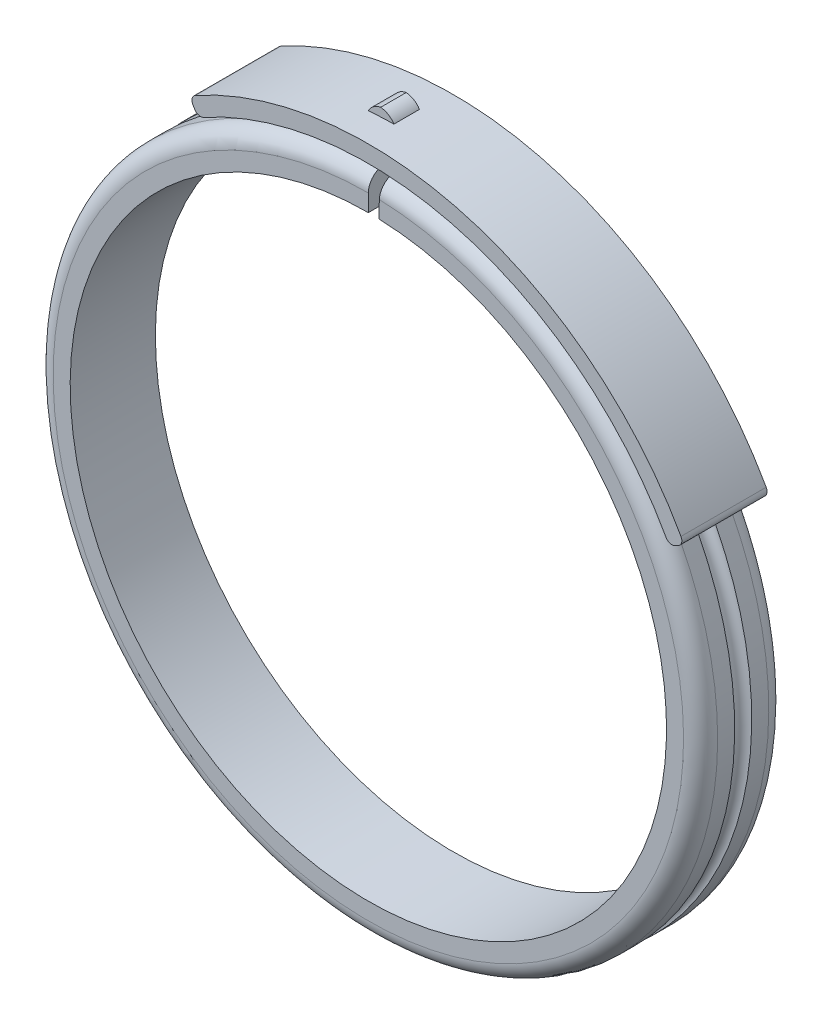
ISO-10303-21;
HEADER;
FILE_DESCRIPTION(('STEP AP214'),'2;1');
FILE_NAME('part.step','',(''),(''),'','','');
FILE_SCHEMA(('AUTOMOTIVE_DESIGN { 1 0 10303 214 1 1 1 1 }'));
ENDSEC;
DATA;
#1=APPLICATION_CONTEXT('core data for automotive mechanical design processes');
#2=APPLICATION_PROTOCOL_DEFINITION('international standard','automotive_design',2000,#1);
#3=PRODUCT_CONTEXT('',#1,'mechanical');
#4=PRODUCT('Part','Part','',(#3));
#5=PRODUCT_RELATED_PRODUCT_CATEGORY('part','',(#4));
#6=PRODUCT_DEFINITION_FORMATION('','',#4);
#7=PRODUCT_DEFINITION_CONTEXT('part definition',#1,'design');
#8=PRODUCT_DEFINITION('design','',#6,#7);
#9=PRODUCT_DEFINITION_SHAPE('','',#8);
#10=(LENGTH_UNIT() NAMED_UNIT(*) SI_UNIT(.MILLI.,.METRE.));
#11=(NAMED_UNIT(*) PLANE_ANGLE_UNIT() SI_UNIT($,.RADIAN.));
#12=(NAMED_UNIT(*) SI_UNIT($,.STERADIAN.) SOLID_ANGLE_UNIT());
#13=UNCERTAINTY_MEASURE_WITH_UNIT(LENGTH_MEASURE(1.E-05),#10,'distance_accuracy_value','');
#14=(GEOMETRIC_REPRESENTATION_CONTEXT(3) GLOBAL_UNCERTAINTY_ASSIGNED_CONTEXT((#13)) GLOBAL_UNIT_ASSIGNED_CONTEXT((#10,
#11,#12)) REPRESENTATION_CONTEXT('',''));
#15=CARTESIAN_POINT('',(0.,0.,0.));
#16=DIRECTION('',(0.,0.,1.));
#17=DIRECTION('',(1.,0.,0.));
#18=AXIS2_PLACEMENT_3D('',#15,#16,#17);
#19=CARTESIAN_POINT('',(0.,0.,10.));
#20=DIRECTION('',(0.,0.,-1.));
#21=DIRECTION('',(-1.,0.,0.));
#22=AXIS2_PLACEMENT_3D('',#19,#20,#21);
#23=CYLINDRICAL_SURFACE('',#22,39.);
#24=DIRECTION('',(0.,0.,-1.));
#25=VECTOR('',#24,1.);
#26=CARTESIAN_POINT('',(0.,39.,10.));
#27=LINE('',#26,#25);
#28=CARTESIAN_POINT('',(0.,39.,4.00000513685877));
#29=VERTEX_POINT('',#28);
#30=CARTESIAN_POINT('',(0.,39.,2.));
#31=VERTEX_POINT('',#30);
#32=EDGE_CURVE('E345',#29,#31,#27,.T.);
#33=ORIENTED_EDGE('',*,*,#32,.T.);
#34=CARTESIAN_POINT('',(0.,0.,2.));
#35=DIRECTION('',(0.,0.,1.));
#36=DIRECTION('',(1.,0.,0.));
#37=AXIS2_PLACEMENT_3D('',#34,#35,#36);
#38=CIRCLE('',#37,39.);
#39=CARTESIAN_POINT('',(1.36108037139754,38.9762422537448,2.));
#40=VERTEX_POINT('',#39);
#41=EDGE_CURVE('E258',#31,#40,#38,.T.);
#42=ORIENTED_EDGE('',*,*,#41,.T.);
#43=DIRECTION('',(0.,0.,-1.));
#44=VECTOR('',#43,1.);
#45=CARTESIAN_POINT('',(1.36108037139754,38.9762422537448,10.));
#46=LINE('',#45,#44);
#47=CARTESIAN_POINT('',(1.36108037139754,38.9762422537447,4.00000513685877));
#48=VERTEX_POINT('',#47);
#49=EDGE_CURVE('E269',#48,#40,#46,.T.);
#50=ORIENTED_EDGE('',*,*,#49,.F.);
#51=CARTESIAN_POINT('',(0.,0.,4.00000513685877));
#52=DIRECTION('',(0.,0.,1.));
#53=DIRECTION('',(1.,0.,0.));
#54=AXIS2_PLACEMENT_3D('',#51,#52,#53);
#55=CIRCLE('',#54,39.);
#56=CARTESIAN_POINT('',(-3.5,38.8426312188036,4.00000513685877));
#57=VERTEX_POINT('',#56);
#58=EDGE_CURVE('E249',#48,#57,#55,.F.);
#59=ORIENTED_EDGE('',*,*,#58,.T.);
#60=DIRECTION('',(0.,0.,-1.));
#61=VECTOR('',#60,1.);
#62=CARTESIAN_POINT('',(-3.5,38.8426312188039,10.));
#63=LINE('',#62,#61);
#64=CARTESIAN_POINT('',(-3.5,38.8426312188039,3.5));
#65=VERTEX_POINT('',#64);
#66=EDGE_CURVE('E265',#57,#65,#63,.T.);
#67=ORIENTED_EDGE('',*,*,#66,.T.);
#68=CARTESIAN_POINT('',(0.,0.,3.5));
#69=DIRECTION('',(0.,0.,1.));
#70=DIRECTION('',(1.,0.,0.));
#71=AXIS2_PLACEMENT_3D('',#68,#69,#70);
#72=CIRCLE('',#71,39.);
#73=CARTESIAN_POINT('',(-0.499999999999998,38.9967947400809,3.5));
#74=VERTEX_POINT('',#73);
#75=EDGE_CURVE('E285',#74,#65,#72,.T.);
#76=ORIENTED_EDGE('',*,*,#75,.F.);
#77=DIRECTION('',(0.,0.,-1.));
#78=VECTOR('',#77,1.);
#79=CARTESIAN_POINT('',(-0.5,38.9967947400809,10.));
#80=LINE('',#79,#78);
#81=CARTESIAN_POINT('',(-0.5,38.9967947400809,4.00000513685877));
#82=VERTEX_POINT('',#81);
#83=EDGE_CURVE('E298',#82,#74,#80,.T.);
#84=ORIENTED_EDGE('',*,*,#83,.F.);
#85=EDGE_CURVE('E273',#82,#29,#55,.F.);
#86=ORIENTED_EDGE('',*,*,#85,.T.);
#87=EDGE_LOOP('',(#33,#42,#50,#59,#67,#76,#84,#86));
#88=FACE_BOUND('',#87,.T.);
#89=ADVANCED_FACE('F77',(#88),#23,.T.);
#90=CARTESIAN_POINT('',(-0.5,38.9967947400809,6.5));
#91=DIRECTION('',(0.,0.,1.));
#92=DIRECTION('',(1.,0.,0.));
#93=AXIS2_PLACEMENT_3D('',#90,#91,#92);
#94=PLANE('',#93);
#95=CARTESIAN_POINT('',(0.,0.,6.5));
#96=DIRECTION('',(0.,0.,1.));
#97=DIRECTION('',(1.,0.,0.));
#98=AXIS2_PLACEMENT_3D('',#95,#96,#97);
#99=CIRCLE('',#98,40.);
#100=CARTESIAN_POINT('',(-3.5,39.8465807817936,6.5));
#101=VERTEX_POINT('',#100);
#102=CARTESIAN_POINT('',(-0.5,39.9968748779201,6.5));
#103=VERTEX_POINT('',#102);
#104=EDGE_CURVE('E546',#101,#103,#99,.F.);
#105=ORIENTED_EDGE('',*,*,#104,.F.);
#106=DIRECTION('',(0.,1.,0.));
#107=VECTOR('',#106,1.);
#108=CARTESIAN_POINT('',(-3.5,38.8426312188039,6.5));
#109=LINE('',#108,#107);
#110=CARTESIAN_POINT('',(-3.5,38.8426312188039,6.5));
#111=VERTEX_POINT('',#110);
#112=EDGE_CURVE('E304',#111,#101,#109,.T.);
#113=ORIENTED_EDGE('',*,*,#112,.F.);
#114=CARTESIAN_POINT('',(0.,0.,6.5));
#115=DIRECTION('',(0.,0.,-1.));
#116=DIRECTION('',(-1.,0.,0.));
#117=AXIS2_PLACEMENT_3D('',#114,#115,#116);
#118=CIRCLE('',#117,39.);
#119=CARTESIAN_POINT('',(-0.5,38.9967947400809,6.5));
#120=VERTEX_POINT('',#119);
#121=EDGE_CURVE('E299',#111,#120,#118,.T.);
#122=ORIENTED_EDGE('',*,*,#121,.T.);
#123=DIRECTION('',(0.,1.,0.));
#124=VECTOR('',#123,1.);
#125=CARTESIAN_POINT('',(-0.5,38.9967947400809,6.5));
#126=LINE('',#125,#124);
#127=EDGE_CURVE('E303',#120,#103,#126,.T.);
#128=ORIENTED_EDGE('',*,*,#127,.T.);
#129=EDGE_LOOP('',(#105,#113,#122,#128));
#130=FACE_BOUND('',#129,.T.);
#131=ADVANCED_FACE('F420',(#130),#94,.T.);
#132=CARTESIAN_POINT('',(-3.5,38.8426312188039,3.5));
#133=DIRECTION('',(0.,0.,-1.));
#134=DIRECTION('',(-1.,0.,0.));
#135=AXIS2_PLACEMENT_3D('',#132,#133,#134);
#136=PLANE('',#135);
#137=CARTESIAN_POINT('',(0.,0.,3.5));
#138=DIRECTION('',(0.,0.,-1.));
#139=DIRECTION('',(-1.,0.,0.));
#140=AXIS2_PLACEMENT_3D('',#137,#138,#139);
#141=CIRCLE('',#140,40.);
#142=CARTESIAN_POINT('',(-0.499999999999998,39.9968748779201,3.5));
#143=VERTEX_POINT('',#142);
#144=CARTESIAN_POINT('',(-3.5,39.8465807817936,3.5));
#145=VERTEX_POINT('',#144);
#146=EDGE_CURVE('E504',#143,#145,#141,.F.);
#147=ORIENTED_EDGE('',*,*,#146,.F.);
#148=DIRECTION('',(0.,1.,0.));
#149=VECTOR('',#148,1.);
#150=CARTESIAN_POINT('',(-0.499999999999998,38.9967947400809,3.5));
#151=LINE('',#150,#149);
#152=EDGE_CURVE('E293',#74,#143,#151,.T.);
#153=ORIENTED_EDGE('',*,*,#152,.F.);
#154=ORIENTED_EDGE('',*,*,#75,.T.);
#155=DIRECTION('',(0.,1.,0.));
#156=VECTOR('',#155,1.);
#157=CARTESIAN_POINT('',(-3.5,38.8426312188039,3.5));
#158=LINE('',#157,#156);
#159=EDGE_CURVE('E277',#65,#145,#158,.T.);
#160=ORIENTED_EDGE('',*,*,#159,.T.);
#161=EDGE_LOOP('',(#147,#153,#154,#160));
#162=FACE_BOUND('',#161,.T.);
#163=ADVANCED_FACE('F413',(#162),#136,.T.);
#164=CARTESIAN_POINT('',(0.,0.,10.));
#165=DIRECTION('',(-1.,0.,0.));
#166=DIRECTION('',(0.,0.,1.));
#167=AXIS2_PLACEMENT_3D('',#164,#165,#166);
#168=PLANE('',#167);
#169=DIRECTION('',(0.,1.,0.));
#170=VECTOR('',#169,1.);
#171=CARTESIAN_POINT('',(0.,0.,0.));
#172=LINE('',#171,#170);
#173=CARTESIAN_POINT('',(0.,35.,0.));
#174=VERTEX_POINT('',#173);
#175=CARTESIAN_POINT('',(0.,37.,0.));
#176=VERTEX_POINT('',#175);
#177=EDGE_CURVE('E284',#174,#176,#172,.T.);
#178=ORIENTED_EDGE('',*,*,#177,.T.);
#179=CARTESIAN_POINT('',(0.,37.,2.));
#180=DIRECTION('',(-1.,0.,0.));
#181=DIRECTION('',(0.,0.,1.));
#182=AXIS2_PLACEMENT_3D('',#179,#180,#181);
#183=CIRCLE('',#182,2.);
#184=EDGE_CURVE('E449',#176,#31,#183,.F.);
#185=ORIENTED_EDGE('',*,*,#184,.T.);
#186=ORIENTED_EDGE('',*,*,#32,.F.);
#187=CARTESIAN_POINT('',(0.,38.9967947400809,5.));
#188=DIRECTION('',(-1.,0.,0.));
#189=DIRECTION('',(0.,0.,1.));
#190=AXIS2_PLACEMENT_3D('',#187,#188,#189);
#191=CIRCLE('',#190,1.);
#192=CARTESIAN_POINT('',(0.,39.,5.99999486314123));
#193=VERTEX_POINT('',#192);
#194=EDGE_CURVE('E371',#29,#193,#191,.T.);
#195=ORIENTED_EDGE('',*,*,#194,.T.);
#196=CARTESIAN_POINT('',(0.,39.,8.));
#197=VERTEX_POINT('',#196);
#198=EDGE_CURVE('E346',#197,#193,#27,.T.);
#199=ORIENTED_EDGE('',*,*,#198,.F.);
#200=CARTESIAN_POINT('',(0.,37.,8.));
#201=DIRECTION('',(-1.,0.,0.));
#202=DIRECTION('',(0.,0.,1.));
#203=AXIS2_PLACEMENT_3D('',#200,#201,#202);
#204=CIRCLE('',#203,2.);
#205=CARTESIAN_POINT('',(0.,37.,10.));
#206=VERTEX_POINT('',#205);
#207=EDGE_CURVE('E93',#197,#206,#204,.F.);
#208=ORIENTED_EDGE('',*,*,#207,.T.);
#209=DIRECTION('',(0.,1.,0.));
#210=VECTOR('',#209,1.);
#211=CARTESIAN_POINT('',(0.,0.,10.));
#212=LINE('',#211,#210);
#213=CARTESIAN_POINT('',(0.,35.,10.));
#214=VERTEX_POINT('',#213);
#215=EDGE_CURVE('E314',#214,#206,#212,.T.);
#216=ORIENTED_EDGE('',*,*,#215,.F.);
#217=DIRECTION('',(0.,0.,-1.));
#218=VECTOR('',#217,1.);
#219=CARTESIAN_POINT('',(0.,35.,10.));
#220=LINE('',#219,#218);
#221=EDGE_CURVE('E326',#214,#174,#220,.T.);
#222=ORIENTED_EDGE('',*,*,#221,.T.);
#223=EDGE_LOOP('',(#178,#185,#186,#195,#199,#208,#216,#222));
#224=FACE_BOUND('',#223,.T.);
#225=ADVANCED_FACE('F425',(#224),#168,.F.);
#226=CARTESIAN_POINT('',(1.36108037139754,38.9762422537448,8.));
#227=VERTEX_POINT('',#226);
#228=CARTESIAN_POINT('',(1.36108037139754,38.9762422537447,5.99999486314123));
#229=VERTEX_POINT('',#228);
#230=EDGE_CURVE('E342',#227,#229,#46,.T.);
#231=ORIENTED_EDGE('',*,*,#230,.F.);
#232=CARTESIAN_POINT('',(0.,0.,8.));
#233=DIRECTION('',(0.,0.,1.));
#234=DIRECTION('',(1.,0.,0.));
#235=AXIS2_PLACEMENT_3D('',#232,#233,#234);
#236=CIRCLE('',#235,39.);
#237=EDGE_CURVE('E12',#227,#197,#236,.F.);
#238=ORIENTED_EDGE('',*,*,#237,.T.);
#239=ORIENTED_EDGE('',*,*,#198,.T.);
#240=CARTESIAN_POINT('',(0.,0.,5.99999486314123));
#241=DIRECTION('',(0.,0.,-1.));
#242=DIRECTION('',(-1.,0.,0.));
#243=AXIS2_PLACEMENT_3D('',#240,#241,#242);
#244=CIRCLE('',#243,39.);
#245=CARTESIAN_POINT('',(-0.5,38.9967947400808,5.99999486314123));
#246=VERTEX_POINT('',#245);
#247=EDGE_CURVE('E399',#193,#246,#244,.F.);
#248=ORIENTED_EDGE('',*,*,#247,.T.);
#249=EDGE_CURVE('E294',#120,#246,#80,.T.);
#250=ORIENTED_EDGE('',*,*,#249,.F.);
#251=ORIENTED_EDGE('',*,*,#121,.F.);
#252=CARTESIAN_POINT('',(-3.5,38.8426312188039,5.99999486314123));
#253=VERTEX_POINT('',#252);
#254=EDGE_CURVE('E280',#111,#253,#63,.T.);
#255=ORIENTED_EDGE('',*,*,#254,.T.);
#256=EDGE_CURVE('E252',#253,#229,#244,.F.);
#257=ORIENTED_EDGE('',*,*,#256,.T.);
#258=EDGE_LOOP('',(#231,#238,#239,#248,#250,#251,#255,#257));
#259=FACE_BOUND('',#258,.T.);
#260=ADVANCED_FACE('F429',(#259),#23,.T.);
#261=CARTESIAN_POINT('',(0.,0.,10.));
#262=DIRECTION('',(-0.999390827019096,0.0348994967025011,0.));
#263=DIRECTION('',(-0.0348994967025011,-0.999390827019096,0.));
#264=AXIS2_PLACEMENT_3D('',#261,#262,#263);
#265=PLANE('',#264);
#266=ORIENTED_EDGE('',*,*,#49,.T.);
#267=CARTESIAN_POINT('',(1.29128137799254,36.9774605997065,2.));
#268=DIRECTION('',(-0.999390827019096,0.0348994967025011,0.));
#269=DIRECTION('',(-0.0348994967025011,-0.999390827019096,0.));
#270=AXIS2_PLACEMENT_3D('',#267,#268,#269);
#271=CIRCLE('',#270,2.);
#272=CARTESIAN_POINT('',(1.29128137799254,36.9774605997066,0.));
#273=VERTEX_POINT('',#272);
#274=EDGE_CURVE('E455',#40,#273,#271,.T.);
#275=ORIENTED_EDGE('',*,*,#274,.T.);
#276=DIRECTION('',(0.0348994967025011,0.999390827019096,0.));
#277=VECTOR('',#276,1.);
#278=CARTESIAN_POINT('',(0.,0.,0.));
#279=LINE('',#278,#277);
#280=CARTESIAN_POINT('',(1.22148238458754,34.9786789456684,0.));
#281=VERTEX_POINT('',#280);
#282=EDGE_CURVE('E330',#281,#273,#279,.T.);
#283=ORIENTED_EDGE('',*,*,#282,.F.);
#284=DIRECTION('',(0.,0.,-1.));
#285=VECTOR('',#284,1.);
#286=CARTESIAN_POINT('',(1.22148238458754,34.9786789456684,10.));
#287=LINE('',#286,#285);
#288=CARTESIAN_POINT('',(1.22148238458754,34.9786789456684,10.));
#289=VERTEX_POINT('',#288);
#290=EDGE_CURVE('E339',#289,#281,#287,.T.);
#291=ORIENTED_EDGE('',*,*,#290,.F.);
#292=DIRECTION('',(0.0348994967025011,0.999390827019096,0.));
#293=VECTOR('',#292,1.);
#294=CARTESIAN_POINT('',(0.,0.,10.));
#295=LINE('',#294,#293);
#296=CARTESIAN_POINT('',(1.29128137799254,36.9774605997066,10.));
#297=VERTEX_POINT('',#296);
#298=EDGE_CURVE('E317',#289,#297,#295,.T.);
#299=ORIENTED_EDGE('',*,*,#298,.T.);
#300=CARTESIAN_POINT('',(1.29128137799254,36.9774605997065,8.));
#301=DIRECTION('',(-0.999390827019096,0.0348994967025011,0.));
#302=DIRECTION('',(-0.0348994967025011,-0.999390827019096,0.));
#303=AXIS2_PLACEMENT_3D('',#300,#301,#302);
#304=CIRCLE('',#303,2.);
#305=EDGE_CURVE('E446',#297,#227,#304,.T.);
#306=ORIENTED_EDGE('',*,*,#305,.T.);
#307=ORIENTED_EDGE('',*,*,#230,.T.);
#308=CARTESIAN_POINT('',(1.36096850943956,38.9730389463834,5.));
#309=DIRECTION('',(-0.999390827019096,0.0348994967025011,0.));
#310=DIRECTION('',(-0.0348994967025011,-0.999390827019096,0.));
#311=AXIS2_PLACEMENT_3D('',#308,#309,#310);
#312=CIRCLE('',#311,1.);
#313=EDGE_CURVE('E271',#48,#229,#312,.T.);
#314=ORIENTED_EDGE('',*,*,#313,.F.);
#315=EDGE_LOOP('',(#266,#275,#283,#291,#299,#306,#307,#314));
#316=FACE_BOUND('',#315,.T.);
#317=ADVANCED_FACE('F437',(#316),#265,.T.);
#318=CARTESIAN_POINT('',(0.,0.,10.));
#319=DIRECTION('',(0.,0.,-1.));
#320=DIRECTION('',(-1.,0.,0.));
#321=AXIS2_PLACEMENT_3D('',#318,#319,#320);
#322=CYLINDRICAL_SURFACE('',#321,35.);
#323=CARTESIAN_POINT('',(0.,0.,0.));
#324=DIRECTION('',(0.,0.,1.));
#325=DIRECTION('',(1.,0.,0.));
#326=AXIS2_PLACEMENT_3D('',#323,#324,#325);
#327=CIRCLE('',#326,35.);
#328=EDGE_CURVE('E318',#174,#281,#327,.T.);
#329=ORIENTED_EDGE('',*,*,#328,.F.);
#330=ORIENTED_EDGE('',*,*,#221,.F.);
#331=CARTESIAN_POINT('',(0.,0.,10.));
#332=DIRECTION('',(0.,0.,1.));
#333=DIRECTION('',(1.,0.,0.));
#334=AXIS2_PLACEMENT_3D('',#331,#332,#333);
#335=CIRCLE('',#334,35.);
#336=EDGE_CURVE('E322',#214,#289,#335,.T.);
#337=ORIENTED_EDGE('',*,*,#336,.T.);
#338=ORIENTED_EDGE('',*,*,#290,.T.);
#339=EDGE_LOOP('',(#329,#330,#337,#338));
#340=FACE_BOUND('',#339,.T.);
#341=ADVANCED_FACE('F442',(#340),#322,.F.);
#342=CARTESIAN_POINT('',(0.,0.,10.));
#343=DIRECTION('',(0.,0.,1.));
#344=DIRECTION('',(1.,0.,0.));
#345=AXIS2_PLACEMENT_3D('',#342,#343,#344);
#346=PLANE('',#345);
#347=ORIENTED_EDGE('',*,*,#215,.T.);
#348=CARTESIAN_POINT('',(0.,0.,10.));
#349=DIRECTION('',(0.,0.,1.));
#350=DIRECTION('',(1.,0.,0.));
#351=AXIS2_PLACEMENT_3D('',#348,#349,#350);
#352=CIRCLE('',#351,37.);
#353=EDGE_CURVE('E86',#206,#297,#352,.T.);
#354=ORIENTED_EDGE('',*,*,#353,.T.);
#355=ORIENTED_EDGE('',*,*,#298,.F.);
#356=ORIENTED_EDGE('',*,*,#336,.F.);
#357=EDGE_LOOP('',(#347,#354,#355,#356));
#358=FACE_BOUND('',#357,.T.);
#359=ADVANCED_FACE('F461',(#358),#346,.T.);
#360=CARTESIAN_POINT('',(0.,0.,0.));
#361=DIRECTION('',(0.,0.,1.));
#362=DIRECTION('',(1.,0.,0.));
#363=AXIS2_PLACEMENT_3D('',#360,#361,#362);
#364=PLANE('',#363);
#365=ORIENTED_EDGE('',*,*,#282,.T.);
#366=CARTESIAN_POINT('',(0.,0.,0.));
#367=DIRECTION('',(0.,0.,1.));
#368=DIRECTION('',(1.,0.,0.));
#369=AXIS2_PLACEMENT_3D('',#366,#367,#368);
#370=CIRCLE('',#369,37.);
#371=EDGE_CURVE('E450',#273,#176,#370,.F.);
#372=ORIENTED_EDGE('',*,*,#371,.T.);
#373=ORIENTED_EDGE('',*,*,#177,.F.);
#374=ORIENTED_EDGE('',*,*,#328,.T.);
#375=EDGE_LOOP('',(#365,#372,#373,#374));
#376=FACE_BOUND('',#375,.T.);
#377=ADVANCED_FACE('F405',(#376),#364,.F.);
#378=CARTESIAN_POINT('',(-0.5,38.9967947400809,10.));
#379=DIRECTION('',(1.,0.,0.));
#380=DIRECTION('',(0.,0.,-1.));
#381=AXIS2_PLACEMENT_3D('',#378,#379,#380);
#382=PLANE('',#381);
#383=CARTESIAN_POINT('',(-0.5,39.3134523035417,4.05252742084889));
#384=CARTESIAN_POINT('',(-0.5,39.3666763489721,4.07049536328212));
#385=CARTESIAN_POINT('',(-0.5,39.418421866654,4.09297090989669));
#386=CARTESIAN_POINT('',(-0.5,39.5174476413445,4.14631007915281));
#387=CARTESIAN_POINT('',(-0.5,39.5647224482832,4.17718376643209));
#388=CARTESIAN_POINT('',(-0.5,39.6533981889157,4.24641954690498));
#389=CARTESIAN_POINT('',(-0.5,39.6948018969857,4.28477808264949));
#390=CARTESIAN_POINT('',(-0.5,39.7705695435139,4.36789198018343));
#391=CARTESIAN_POINT('',(-0.5,39.8049352292941,4.41264574953957));
#392=CARTESIAN_POINT('',(-0.5,39.8656674420785,4.50728996182421));
#393=CARTESIAN_POINT('',(-0.5,39.8920335756067,4.55718065726245));
#394=CARTESIAN_POINT('',(-0.5,39.9360159378755,4.66068257961143));
#395=CARTESIAN_POINT('',(-0.5,39.9536318265731,4.71429395101899));
#396=CARTESIAN_POINT('',(-0.5,39.9796107684409,4.82370853199369));
#397=CARTESIAN_POINT('',(-0.5,39.9879746409366,4.87951154702345));
#398=CARTESIAN_POINT('',(-0.5,39.9952147545616,4.99172958139748));
#399=CARTESIAN_POINT('',(-0.5,39.9940910172961,5.04814459934778));
#400=CARTESIAN_POINT('',(-0.5,39.982388084535,5.15998330610858));
#401=CARTESIAN_POINT('',(-0.5,39.9718092045313,5.21540702793295));
#402=CARTESIAN_POINT('',(-0.5,39.9414968857227,5.32369170409303));
#403=CARTESIAN_POINT('',(-0.5,39.9217634634393,5.37655266305365));
#404=CARTESIAN_POINT('',(-0.5,39.8737021016549,5.47821222697485));
#405=CARTESIAN_POINT('',(-0.5,39.8453740418465,5.52701077505775));
#406=CARTESIAN_POINT('',(-0.5,39.7809278308732,5.61915977847024));
#407=CARTESIAN_POINT('',(-0.5,39.7448096695097,5.66251022666713));
#408=CARTESIAN_POINT('',(-0.5,39.665806439823,5.74253507549269));
#409=CARTESIAN_POINT('',(-0.5,39.6229209877829,5.77920909730263));
#410=CARTESIAN_POINT('',(-0.5,39.5316021581726,5.84483740312404));
#411=CARTESIAN_POINT('',(-0.5,39.4831687805567,5.87379168707223));
#412=CARTESIAN_POINT('',(-0.5,39.3821249505972,5.92316097606307));
#413=CARTESIAN_POINT('',(-0.5,39.3295141753165,5.94357532015265));
#414=CARTESIAN_POINT('',(-0.5,39.2216122062412,5.97528231380991));
#415=CARTESIAN_POINT('',(-0.5,39.166321011023,5.98657495853267));
#416=CARTESIAN_POINT('',(-0.5,39.0546239105505,5.99971862140235));
#417=CARTESIAN_POINT('',(-0.5,38.9982179330578,6.0015690256595));
#418=CARTESIAN_POINT('',(-0.5,38.8858958817375,5.99577406778638));
#419=CARTESIAN_POINT('',(-0.5,38.8299798079925,5.98812870405835));
#420=CARTESIAN_POINT('',(-0.5,38.7202234646767,5.96355884165316));
#421=CARTESIAN_POINT('',(-0.5,38.6663832452618,5.94663411892265));
#422=CARTESIAN_POINT('',(-0.5,38.562308523107,5.90398563755772));
#423=CARTESIAN_POINT('',(-0.5,38.5120740202493,5.8782618792109));
#424=CARTESIAN_POINT('',(-0.5,38.4166384042141,5.81874619941235));
#425=CARTESIAN_POINT('',(-0.5,38.3714371447419,5.78495451255036));
#426=CARTESIAN_POINT('',(-0.5,38.2873498473086,5.71026162422688));
#427=CARTESIAN_POINT('',(-0.5,38.2484638063342,5.66936042615767));
#428=CARTESIAN_POINT('',(-0.5,38.1781138187394,5.58161266116353));
#429=CARTESIAN_POINT('',(-0.5,38.1466493419187,5.5347665193164));
#430=CARTESIAN_POINT('',(-0.5,38.0920325219769,5.43645634837551));
#431=CARTESIAN_POINT('',(-0.5,38.0688801783541,5.38499231956051));
#432=CARTESIAN_POINT('',(-0.5,38.0315468166066,5.27891183466674));
#433=CARTESIAN_POINT('',(-0.5,38.0173650636252,5.22429563720878));
#434=CARTESIAN_POINT('',(-0.5,37.9983727077818,5.11345753949215));
#435=CARTESIAN_POINT('',(-0.5,37.9935620915709,5.05723564152085));
#436=CARTESIAN_POINT('',(-0.5,37.9934486226344,4.94478539794909));
#437=CARTESIAN_POINT('',(-0.5,37.9981452402939,4.88855705288227));
#438=CARTESIAN_POINT('',(-0.5,38.0169117920267,4.77768685328563));
#439=CARTESIAN_POINT('',(-0.5,38.0309817420479,4.72304500145528));
#440=CARTESIAN_POINT('',(-0.5,38.0680952920296,4.61689917404539));
#441=CARTESIAN_POINT('',(-0.5,38.09113885421,4.56539518525606));
#442=CARTESIAN_POINT('',(-0.5,38.1455453140835,4.46698653821868));
#443=CARTESIAN_POINT('',(-0.5,38.1769082303259,4.4200818902258));
#444=CARTESIAN_POINT('',(-0.5,38.2470653275473,4.33220001508429));
#445=CARTESIAN_POINT('',(-0.5,38.2858600318204,4.29122320568909));
#446=CARTESIAN_POINT('',(-0.5,38.3697763012164,4.21636526733424));
#447=CARTESIAN_POINT('',(-0.5,38.4148976205962,4.18248386289688));
#448=CARTESIAN_POINT('',(-0.5,38.510185861734,4.12277653550481));
#449=CARTESIAN_POINT('',(-0.5,38.5603526665664,4.09695042593084));
#450=CARTESIAN_POINT('',(-0.5,38.664323934854,4.05408027224247));
#451=CARTESIAN_POINT('',(-0.5,38.7181293007874,4.03703841600458));
#452=CARTESIAN_POINT('',(-0.5,38.8278621761751,4.01222165966183));
#453=CARTESIAN_POINT('',(-0.5,38.883790838563,4.00445187067841));
#454=CARTESIAN_POINT('',(-0.5,38.9961119651934,3.99842673929528));
#455=CARTESIAN_POINT('',(-0.5,39.0525037908527,4.00015996719307));
#456=CARTESIAN_POINT('',(-0.5,39.1431913029414,4.01062714935572));
#457=CARTESIAN_POINT('',(-0.5,39.1778432223872,4.01649221166495));
#458=CARTESIAN_POINT('',(-0.5,39.2463400720328,4.03182698167145));
#459=CARTESIAN_POINT('',(-0.5,39.2801850022025,4.04129668950296));
#460=CARTESIAN_POINT('',(-0.5,39.3134523035417,4.05252742084889));
#461=B_SPLINE_CURVE_WITH_KNOTS('',3,(#383,#384,#385,#386,#387,#388,#389,#390,#391,#392,#393,
#394,#395,#396,#397,#398,#399,#400,#401,#402,#403,#404,#405,#406,#407,#408,#409,#410,#411,#412,
#413,#414,#415,#416,#417,#418,#419,#420,#421,#422,#423,#424,#425,#426,#427,#428,#429,#430,#431,
#432,#433,#434,#435,#436,#437,#438,#439,#440,#441,#442,#443,#444,#445,#446,#447,#448,#449,#450,
#451,#452,#453,#454,#455,#456,#457,#458,#459,#460),.UNSPECIFIED.,.T.,.F.,(4,2,2,2,2,2,2,2,2,2,2,
2,2,2,2,2,2,2,2,2,2,2,2,2,2,2,2,2,2,2,2,2,2,2,2,2,2,2,4),(0.,0.168397262966872,
0.336997235322861,0.505517268682657,0.673995412907444,0.842481842768177,1.0109748196632,
1.17945287423018,1.34793054513782,1.51640259462084,1.6848743400581,1.85334844386589,
2.02182276823874,2.19030664882451,2.35879053079173,2.52728745024512,2.6957844591946,
2.86429242288235,3.03280041492328,3.20131247582739,3.36982453122363,3.53833168742137,
3.70683876321689,3.87533379713193,4.04382882087593,4.21231003998279,4.38079101909422,
4.54926261297638,4.71773449350155,4.88620566474457,5.0546772116199,5.22316062543738,
5.3916374967062,5.56011046453431,5.7286253733383,5.89723313122,6.06563814154624,
6.17089361842466,6.27614909922322),.UNSPECIFIED.);
#462=EDGE_CURVE('E391',#82,#246,#461,.T.);
#463=ORIENTED_EDGE('',*,*,#462,.F.);
#464=ORIENTED_EDGE('',*,*,#83,.T.);
#465=ORIENTED_EDGE('',*,*,#152,.T.);
#466=DIRECTION('',(0.,0.,-1.));
#467=VECTOR('',#466,1.);
#468=CARTESIAN_POINT('',(-0.5,39.9968748779201,10.));
#469=LINE('',#468,#467);
#470=EDGE_CURVE('E509',#103,#143,#469,.T.);
#471=ORIENTED_EDGE('',*,*,#470,.F.);
#472=ORIENTED_EDGE('',*,*,#127,.F.);
#473=ORIENTED_EDGE('',*,*,#249,.T.);
#474=EDGE_LOOP('',(#463,#464,#465,#471,#472,#473));
#475=FACE_BOUND('',#474,.T.);
#476=ADVANCED_FACE('F401',(#475),#382,.T.);
#477=CARTESIAN_POINT('',(-3.5,38.8426312188039,10.));
#478=DIRECTION('',(1.,0.,0.));
#479=DIRECTION('',(0.,0.,-1.));
#480=AXIS2_PLACEMENT_3D('',#477,#478,#479);
#481=PLANE('',#480);
#482=ORIENTED_EDGE('',*,*,#66,.F.);
#483=CARTESIAN_POINT('',(-3.5,39.1600785364807,4.05237393547199));
#484=CARTESIAN_POINT('',(-3.5,39.2135485089429,4.07032615153839));
#485=CARTESIAN_POINT('',(-3.5,39.2655446711879,4.09279501311429));
#486=CARTESIAN_POINT('',(-3.5,39.3650747530932,4.14615448294312));
#487=CARTESIAN_POINT('',(-3.5,39.4126033624926,4.17705494721768));
#488=CARTESIAN_POINT('',(-3.5,39.5017810185969,4.24639771930616));
#489=CARTESIAN_POINT('',(-3.5,39.5434319553887,4.28483759312107));
#490=CARTESIAN_POINT('',(-3.5,39.6196556954459,4.36817204840244));
#491=CARTESIAN_POINT('',(-3.5,39.6542302860926,4.4130649950284));
#492=CARTESIAN_POINT('',(-3.5,39.715232311306,4.50791459609917));
#493=CARTESIAN_POINT('',(-3.5,39.7416809655564,4.55785760130451));
#494=CARTESIAN_POINT('',(-3.5,39.7857856714877,4.66148803812874));
#495=CARTESIAN_POINT('',(-3.5,39.8034415547192,4.71517554146121));
#496=CARTESIAN_POINT('',(-3.5,39.8293989349202,4.82456944378993));
#497=CARTESIAN_POINT('',(-3.5,39.8377326008926,4.88026821100624));
#498=CARTESIAN_POINT('',(-3.5,39.8449125671588,4.99227351609754));
#499=CARTESIAN_POINT('',(-3.5,39.8437590107083,5.0485800447826));
#500=CARTESIAN_POINT('',(-3.5,39.8320086990956,5.16009975690334));
#501=CARTESIAN_POINT('',(-3.5,39.8214282973667,5.21531466456631));
#502=CARTESIAN_POINT('',(-3.5,39.7911537984912,5.32318609370552));
#503=CARTESIAN_POINT('',(-3.5,39.7714597184095,5.37584261997204));
#504=CARTESIAN_POINT('',(-3.5,39.7235105019116,5.47714445360607));
#505=CARTESIAN_POINT('',(-3.5,39.6952496168334,5.52578703949112));
#506=CARTESIAN_POINT('',(-3.5,39.6309840956228,5.617654574289));
#507=CARTESIAN_POINT('',(-3.5,39.5949793557402,5.66087945060453));
#508=CARTESIAN_POINT('',(-3.5,39.5161437040378,5.74081712212719));
#509=CARTESIAN_POINT('',(-3.5,39.4732939592853,5.77751134265808));
#510=CARTESIAN_POINT('',(-3.5,39.3820620498418,5.84321756762893));
#511=CARTESIAN_POINT('',(-3.5,39.3336797766464,5.87222942136476));
#512=CARTESIAN_POINT('',(-3.5,39.2325596545275,5.92186360447424));
#513=CARTESIAN_POINT('',(-3.5,39.1798059800168,5.94245369292749));
#514=CARTESIAN_POINT('',(-3.5,39.0715971893666,5.97451709911938));
#515=CARTESIAN_POINT('',(-3.5,39.0161420200629,5.98599023736344));
#516=CARTESIAN_POINT('',(-3.5,38.9039138914279,5.99952618022779));
#517=CARTESIAN_POINT('',(-3.5,38.8471372760212,6.00155868523956));
#518=CARTESIAN_POINT('',(-3.5,38.734046588673,5.99607564533704));
#519=CARTESIAN_POINT('',(-3.5,38.677732521643,5.98855999916819));
#520=CARTESIAN_POINT('',(-3.5,38.5670952948732,5.9641743208052));
#521=CARTESIAN_POINT('',(-3.5,38.5127746268876,5.94729297946028));
#522=CARTESIAN_POINT('',(-3.5,38.4077441269918,5.90463776920251));
#523=CARTESIAN_POINT('',(-3.5,38.3570342820161,5.87886393246844));
#524=CARTESIAN_POINT('',(-3.5,38.26074645227,5.81918681778782));
#525=CARTESIAN_POINT('',(-3.5,38.2151613211853,5.78529507202128));
#526=CARTESIAN_POINT('',(-3.5,38.1303532530034,5.71031475917708));
#527=CARTESIAN_POINT('',(-3.5,38.0911302055905,5.66922631691261));
#528=CARTESIAN_POINT('',(-3.5,38.0203093451174,5.58117097712543));
#529=CARTESIAN_POINT('',(-3.5,37.9886852791062,5.53422519537511));
#530=CARTESIAN_POINT('',(-3.5,37.933805113994,5.4356735577294));
#531=CARTESIAN_POINT('',(-3.5,37.9105488240865,5.38406780812663));
#532=CARTESIAN_POINT('',(-3.5,37.8731611015254,5.27788601792854));
#533=CARTESIAN_POINT('',(-3.5,37.8589930654997,5.22332286453237));
#534=CARTESIAN_POINT('',(-3.5,37.840046482799,5.1125902682501));
#535=CARTESIAN_POINT('',(-3.5,37.8352677550444,5.05642085636305));
#536=CARTESIAN_POINT('',(-3.5,37.8352394288566,4.94423329587819));
#537=CARTESIAN_POINT('',(-3.5,37.8399639143531,4.88821515193138));
#538=CARTESIAN_POINT('',(-3.5,37.8587521213761,4.77776796096083));
#539=CARTESIAN_POINT('',(-3.5,37.8728158145569,4.72333890911451));
#540=CARTESIAN_POINT('',(-3.5,37.9098715188687,4.6176176097286));
#541=CARTESIAN_POINT('',(-3.5,37.9328625397881,4.5663250150259));
#542=CARTESIAN_POINT('',(-3.5,37.9871085397901,4.46831415294187));
#543=CARTESIAN_POINT('',(-3.5,38.0183636237716,4.42159594363524));
#544=CARTESIAN_POINT('',(-3.5,38.0883311189546,4.33392799501339));
#545=CARTESIAN_POINT('',(-3.5,38.1270624538055,4.29299336021378));
#546=CARTESIAN_POINT('',(-3.5,38.2108219706949,4.21817740459782));
#547=CARTESIAN_POINT('',(-3.5,38.2558500363094,4.18429595339984));
#548=CARTESIAN_POINT('',(-3.5,38.3511130970424,4.12440479180737));
#549=CARTESIAN_POINT('',(-3.5,38.4013676941556,4.09842626277244));
#550=CARTESIAN_POINT('',(-3.5,38.5055278211171,4.0552338105022));
#551=CARTESIAN_POINT('',(-3.5,38.5594343258193,4.03802223807921));
#552=CARTESIAN_POINT('',(-3.5,38.6695855118394,4.01279492650047));
#553=CARTESIAN_POINT('',(-3.5,38.7258388669485,4.00481714726548));
#554=CARTESIAN_POINT('',(-3.5,38.8388405244467,3.99841654562487));
#555=CARTESIAN_POINT('',(-3.5,38.8955881641602,3.99998245476119));
#556=CARTESIAN_POINT('',(-3.5,38.9871788480392,4.01025081129772));
#557=CARTESIAN_POINT('',(-3.5,39.0223660336262,4.01610175337957));
#558=CARTESIAN_POINT('',(-3.5,39.0919244333104,4.03149211292163));
#559=CARTESIAN_POINT('',(-3.5,39.1262956460063,4.04103153671587));
#560=CARTESIAN_POINT('',(-3.5,39.1600785364807,4.05237393547199));
#561=B_SPLINE_CURVE_WITH_KNOTS('',3,(#483,#484,#485,#486,#487,#488,#489,#490,#491,#492,#493,
#494,#495,#496,#497,#498,#499,#500,#501,#502,#503,#504,#505,#506,#507,#508,#509,#510,#511,#512,
#513,#514,#515,#516,#517,#518,#519,#520,#521,#522,#523,#524,#525,#526,#527,#528,#529,#530,#531,
#532,#533,#534,#535,#536,#537,#538,#539,#540,#541,#542,#543,#544,#545,#546,#547,#548,#549,#550,
#551,#552,#553,#554,#555,#556,#557,#558,#559,#560),.UNSPECIFIED.,.T.,.F.,(4,2,2,2,2,2,2,2,2,2,2,
2,2,2,2,2,2,2,2,2,2,2,2,2,2,2,2,2,2,2,2,2,2,2,2,2,2,2,4),(0.,0.169080080938275,
0.338358659049461,0.507582677488606,0.676763899529305,0.845499499259319,1.01423833145381,
1.18239306783483,1.35054526511112,1.51840632329897,1.68626706717356,1.85424070247679,
2.02221658838543,2.1906628556718,2.35911242710506,2.52820096817175,2.69729283817263,
2.8669270333888,3.036563027527,3.20640430569887,3.3762449692819,3.54584577596674,
3.71544364153531,3.88444687367492,4.0534462518694,4.22176063109905,4.39007176423283,
4.55792452090106,4.72577676811575,4.89361040261469,5.06144616759116,5.22971245981139,
5.3979756412686,5.56689435078833,5.73585833113977,5.90551447889739,6.07497034847644,
6.18179673689167,6.2886233087547),.UNSPECIFIED.);
#562=EDGE_CURVE('E244',#57,#253,#561,.T.);
#563=ORIENTED_EDGE('',*,*,#562,.T.);
#564=ORIENTED_EDGE('',*,*,#254,.F.);
#565=ORIENTED_EDGE('',*,*,#112,.T.);
#566=DIRECTION('',(0.,0.,-1.));
#567=VECTOR('',#566,1.);
#568=CARTESIAN_POINT('',(-3.5,39.8465807817936,10.));
#569=LINE('',#568,#567);
#570=EDGE_CURVE('E349',#101,#145,#569,.T.);
#571=ORIENTED_EDGE('',*,*,#570,.T.);
#572=ORIENTED_EDGE('',*,*,#159,.F.);
#573=EDGE_LOOP('',(#482,#563,#564,#565,#571,#572));
#574=FACE_BOUND('',#573,.T.);
#575=ADVANCED_FACE('F274',(#574),#481,.F.);
#576=CARTESIAN_POINT('',(35.9950050836381,20.0449397362244,10.));
#577=DIRECTION('',(0.,0.,-1.));
#578=DIRECTION('',(-1.,0.,0.));
#579=AXIS2_PLACEMENT_3D('',#576,#577,#578);
#580=CYLINDRICAL_SURFACE('',#579,0.799999999999993);
#581=CARTESIAN_POINT('',(35.9950050836381,20.0449397362244,0.));
#582=DIRECTION('',(0.,0.,1.));
#583=DIRECTION('',(1.,0.,0.));
#584=AXIS2_PLACEMENT_3D('',#581,#582,#583);
#585=CIRCLE('',#584,0.799999999999993);
#586=CARTESIAN_POINT('',(36.3705823338668,19.3385816619372,0.));
#587=VERTEX_POINT('',#586);
#588=CARTESIAN_POINT('',(36.6939372211845,20.4341618670248,0.));
#589=VERTEX_POINT('',#588);
#590=EDGE_CURVE('E497',#587,#589,#585,.T.);
#591=ORIENTED_EDGE('',*,*,#590,.T.);
#592=DIRECTION('',(0.,0.,-1.));
#593=VECTOR('',#592,1.);
#594=CARTESIAN_POINT('',(36.6939372211845,20.4341618670248,10.));
#595=LINE('',#594,#593);
#596=CARTESIAN_POINT('',(36.6939372211845,20.4341618670248,10.));
#597=VERTEX_POINT('',#596);
#598=EDGE_CURVE('E370',#597,#589,#595,.T.);
#599=ORIENTED_EDGE('',*,*,#598,.F.);
#600=CARTESIAN_POINT('',(35.9950050836381,20.0449397362244,10.));
#601=DIRECTION('',(0.,0.,1.));
#602=DIRECTION('',(1.,0.,0.));
#603=AXIS2_PLACEMENT_3D('',#600,#601,#602);
#604=CIRCLE('',#603,0.799999999999993);
#605=CARTESIAN_POINT('',(36.3705823338668,19.3385816619372,10.));
#606=VERTEX_POINT('',#605);
#607=EDGE_CURVE('E539',#606,#597,#604,.T.);
#608=ORIENTED_EDGE('',*,*,#607,.F.);
#609=DIRECTION('',(0.,0.,-1.));
#610=VECTOR('',#609,1.);
#611=CARTESIAN_POINT('',(36.3705823338668,19.3385816619372,10.));
#612=LINE('',#611,#610);
#613=EDGE_CURVE('E501',#606,#587,#612,.T.);
#614=ORIENTED_EDGE('',*,*,#613,.T.);
#615=EDGE_LOOP('',(#591,#599,#608,#614));
#616=FACE_BOUND('',#615,.T.);
#617=ADVANCED_FACE('F387',(#616),#580,.T.);
#618=CARTESIAN_POINT('',(0.,0.,10.));
#619=DIRECTION('',(0.,0.,-1.));
#620=DIRECTION('',(-1.,0.,0.));
#621=AXIS2_PLACEMENT_3D('',#618,#619,#620);
#622=CYLINDRICAL_SURFACE('',#621,42.);
#623=CARTESIAN_POINT('',(0.,0.,6.5));
#624=DIRECTION('',(0.,0.,1.));
#625=DIRECTION('',(1.,0.,0.));
#626=AXIS2_PLACEMENT_3D('',#623,#624,#625);
#627=CIRCLE('',#626,42.);
#628=CARTESIAN_POINT('',(-3.5,41.8539126008549,6.5));
#629=VERTEX_POINT('',#628);
#630=CARTESIAN_POINT('',(-0.5,41.9970237040674,6.5));
#631=VERTEX_POINT('',#630);
#632=EDGE_CURVE('E289',#629,#631,#627,.F.);
#633=ORIENTED_EDGE('',*,*,#632,.F.);
#634=DIRECTION('',(0.,0.,-1.));
#635=VECTOR('',#634,1.);
#636=CARTESIAN_POINT('',(-3.5,41.8539126008549,10.));
#637=LINE('',#636,#635);
#638=CARTESIAN_POINT('',(-3.5,41.8539126008549,3.5));
#639=VERTEX_POINT('',#638);
#640=EDGE_CURVE('E352',#629,#639,#637,.T.);
#641=ORIENTED_EDGE('',*,*,#640,.T.);
#642=CARTESIAN_POINT('',(0.,0.,3.5));
#643=DIRECTION('',(0.,0.,-1.));
#644=DIRECTION('',(-1.,0.,0.));
#645=AXIS2_PLACEMENT_3D('',#642,#643,#644);
#646=CIRCLE('',#645,42.);
#647=CARTESIAN_POINT('',(-0.499999999999998,41.9970237040674,3.5));
#648=VERTEX_POINT('',#647);
#649=EDGE_CURVE('E549',#648,#639,#646,.F.);
#650=ORIENTED_EDGE('',*,*,#649,.F.);
#651=DIRECTION('',(0.,0.,-1.));
#652=VECTOR('',#651,1.);
#653=CARTESIAN_POINT('',(-0.5,41.9970237040674,10.));
#654=LINE('',#653,#652);
#655=EDGE_CURVE('E551',#631,#648,#654,.T.);
#656=ORIENTED_EDGE('',*,*,#655,.F.);
#657=EDGE_LOOP('',(#633,#641,#650,#656));
#658=FACE_BOUND('',#657,.T.);
#659=CARTESIAN_POINT('',(0.,0.,0.));
#660=DIRECTION('',(0.,0.,1.));
#661=DIRECTION('',(1.,0.,0.));
#662=AXIS2_PLACEMENT_3D('',#659,#660,#661);
#663=CIRCLE('',#662,42.);
#664=CARTESIAN_POINT('',(-20.2897675791129,36.7739762819522,0.));
#665=VERTEX_POINT('',#664);
#666=EDGE_CURVE('E505',#589,#665,#663,.T.);
#667=ORIENTED_EDGE('',*,*,#666,.T.);
#668=DIRECTION('',(0.,0.,-1.));
#669=VECTOR('',#668,1.);
#670=CARTESIAN_POINT('',(-20.2897675791129,36.7739762819522,10.));
#671=LINE('',#670,#669);
#672=CARTESIAN_POINT('',(-20.2897675791129,36.7739762819522,10.));
#673=VERTEX_POINT('',#672);
#674=EDGE_CURVE('E763',#673,#665,#671,.T.);
#675=ORIENTED_EDGE('',*,*,#674,.F.);
#676=CARTESIAN_POINT('',(0.,0.,10.));
#677=DIRECTION('',(0.,0.,1.));
#678=DIRECTION('',(1.,0.,0.));
#679=AXIS2_PLACEMENT_3D('',#676,#677,#678);
#680=CIRCLE('',#679,42.);
#681=EDGE_CURVE('E536',#597,#673,#680,.T.);
#682=ORIENTED_EDGE('',*,*,#681,.F.);
#683=ORIENTED_EDGE('',*,*,#598,.T.);
#684=EDGE_LOOP('',(#667,#675,#682,#683));
#685=FACE_BOUND('',#684,.T.);
#686=ADVANCED_FACE('F486',(#658,#685),#622,.T.);
#687=CARTESIAN_POINT('',(-19.9032958157012,36.0735195908674,10.));
#688=DIRECTION('',(0.,0.,-1.));
#689=DIRECTION('',(-1.,0.,0.));
#690=AXIS2_PLACEMENT_3D('',#687,#688,#689);
#691=CYLINDRICAL_SURFACE('',#690,0.799999999999996);
#692=CARTESIAN_POINT('',(-19.9032958157012,36.0735195908674,0.));
#693=DIRECTION('',(0.,0.,1.));
#694=DIRECTION('',(1.,0.,0.));
#695=AXIS2_PLACEMENT_3D('',#692,#693,#694);
#696=CIRCLE('',#695,0.799999999999996);
#697=CARTESIAN_POINT('',(-20.5961161387287,35.6735195908674,0.));
#698=VERTEX_POINT('',#697);
#699=EDGE_CURVE('E511',#665,#698,#696,.T.);
#700=ORIENTED_EDGE('',*,*,#699,.T.);
#701=DIRECTION('',(0.,0.,-1.));
#702=VECTOR('',#701,1.);
#703=CARTESIAN_POINT('',(-20.5961161387287,35.6735195908674,10.));
#704=LINE('',#703,#702);
#705=CARTESIAN_POINT('',(-20.5961161387287,35.6735195908674,10.));
#706=VERTEX_POINT('',#705);
#707=EDGE_CURVE('E761',#706,#698,#704,.T.);
#708=ORIENTED_EDGE('',*,*,#707,.F.);
#709=CARTESIAN_POINT('',(-19.9032958157012,36.0735195908674,10.));
#710=DIRECTION('',(0.,0.,1.));
#711=DIRECTION('',(1.,0.,0.));
#712=AXIS2_PLACEMENT_3D('',#709,#710,#711);
#713=CIRCLE('',#712,0.799999999999996);
#714=EDGE_CURVE('E533',#673,#706,#713,.T.);
#715=ORIENTED_EDGE('',*,*,#714,.F.);
#716=ORIENTED_EDGE('',*,*,#674,.T.);
#717=EDGE_LOOP('',(#700,#708,#715,#716));
#718=FACE_BOUND('',#717,.T.);
#719=ADVANCED_FACE('F491',(#718),#691,.T.);
#720=CARTESIAN_POINT('',(-20.3960780543712,35.3270434653114,10.));
#721=DIRECTION('',(-0.866025403784438,-0.500000000000002,0.));
#722=DIRECTION('',(0.500000000000002,-0.866025403784438,0.));
#723=AXIS2_PLACEMENT_3D('',#720,#721,#722);
#724=PLANE('',#723);
#725=DIRECTION('',(-0.500000000000002,0.866025403784438,0.));
#726=VECTOR('',#725,1.);
#727=CARTESIAN_POINT('',(-20.3960780543712,35.3270434653114,0.));
#728=LINE('',#727,#726);
#729=CARTESIAN_POINT('',(-20.3960780543712,35.3270434653114,0.));
#730=VERTEX_POINT('',#729);
#731=EDGE_CURVE('E765',#730,#698,#728,.T.);
#732=ORIENTED_EDGE('',*,*,#731,.F.);
#733=DIRECTION('',(0.,0.,-1.));
#734=VECTOR('',#733,1.);
#735=CARTESIAN_POINT('',(-20.3960780543712,35.3270434653114,10.));
#736=LINE('',#735,#734);
#737=CARTESIAN_POINT('',(-20.3960780543712,35.3270434653114,10.));
#738=VERTEX_POINT('',#737);
#739=EDGE_CURVE('E796',#738,#730,#736,.T.);
#740=ORIENTED_EDGE('',*,*,#739,.F.);
#741=DIRECTION('',(-0.500000000000002,0.866025403784438,0.));
#742=VECTOR('',#741,1.);
#743=CARTESIAN_POINT('',(-20.3960780543712,35.3270434653114,10.));
#744=LINE('',#743,#742);
#745=EDGE_CURVE('E529',#738,#706,#744,.T.);
#746=ORIENTED_EDGE('',*,*,#745,.T.);
#747=ORIENTED_EDGE('',*,*,#707,.T.);
#748=EDGE_LOOP('',(#732,#740,#746,#747));
#749=FACE_BOUND('',#748,.T.);
#750=ADVANCED_FACE('F716',(#749),#724,.T.);
#751=CARTESIAN_POINT('',(-19.7032577313436,35.7270434653114,10.));
#752=DIRECTION('',(0.,0.,-1.));
#753=DIRECTION('',(-1.,0.,0.));
#754=AXIS2_PLACEMENT_3D('',#751,#752,#753);
#755=CYLINDRICAL_SURFACE('',#754,0.800000000000006);
#756=CARTESIAN_POINT('',(-19.7032577313436,35.7270434653114,0.));
#757=DIRECTION('',(0.,0.,-1.));
#758=DIRECTION('',(-1.,0.,0.));
#759=AXIS2_PLACEMENT_3D('',#756,#757,#758);
#760=CIRCLE('',#759,0.800000000000006);
#761=CARTESIAN_POINT('',(-19.3169193444546,35.0265132012856,0.));
#762=VERTEX_POINT('',#761);
#763=EDGE_CURVE('E770',#762,#730,#760,.T.);
#764=ORIENTED_EDGE('',*,*,#763,.F.);
#765=DIRECTION('',(0.,0.,-1.));
#766=VECTOR('',#765,1.);
#767=CARTESIAN_POINT('',(-19.3169193444546,35.0265132012856,10.));
#768=LINE('',#767,#766);
#769=CARTESIAN_POINT('',(-19.3169193444546,35.0265132012856,10.));
#770=VERTEX_POINT('',#769);
#771=EDGE_CURVE('E793',#770,#762,#768,.T.);
#772=ORIENTED_EDGE('',*,*,#771,.F.);
#773=CARTESIAN_POINT('',(-19.7032577313436,35.7270434653114,10.));
#774=DIRECTION('',(0.,0.,-1.));
#775=DIRECTION('',(-1.,0.,0.));
#776=AXIS2_PLACEMENT_3D('',#773,#774,#775);
#777=CIRCLE('',#776,0.800000000000006);
#778=EDGE_CURVE('E525',#770,#738,#777,.T.);
#779=ORIENTED_EDGE('',*,*,#778,.T.);
#780=ORIENTED_EDGE('',*,*,#739,.T.);
#781=EDGE_LOOP('',(#764,#772,#779,#780));
#782=FACE_BOUND('',#781,.T.);
#783=ADVANCED_FACE('F706',(#782),#755,.T.);
#784=CARTESIAN_POINT('',(0.,0.,10.));
#785=DIRECTION('',(0.,0.,-1.));
#786=DIRECTION('',(-1.,0.,0.));
#787=AXIS2_PLACEMENT_3D('',#784,#785,#786);
#788=CYLINDRICAL_SURFACE('',#787,40.);
#789=ORIENTED_EDGE('',*,*,#570,.F.);
#790=ORIENTED_EDGE('',*,*,#104,.T.);
#791=ORIENTED_EDGE('',*,*,#470,.T.);
#792=ORIENTED_EDGE('',*,*,#146,.T.);
#793=EDGE_LOOP('',(#789,#790,#791,#792));
#794=FACE_BOUND('',#793,.T.);
#795=CARTESIAN_POINT('',(0.,0.,0.));
#796=DIRECTION('',(0.,0.,1.));
#797=DIRECTION('',(1.,0.,0.));
#798=AXIS2_PLACEMENT_3D('',#795,#796,#797);
#799=CIRCLE('',#798,40.);
#800=CARTESIAN_POINT('',(34.9429007779519,19.4677601490827,0.));
#801=VERTEX_POINT('',#800);
#802=EDGE_CURVE('E774',#801,#762,#799,.T.);
#803=ORIENTED_EDGE('',*,*,#802,.F.);
#804=DIRECTION('',(0.,0.,-1.));
#805=VECTOR('',#804,1.);
#806=CARTESIAN_POINT('',(34.9429007779519,19.4677601490827,10.));
#807=LINE('',#806,#805);
#808=CARTESIAN_POINT('',(34.9429007779519,19.4677601490827,10.));
#809=VERTEX_POINT('',#808);
#810=EDGE_CURVE('E790',#809,#801,#807,.T.);
#811=ORIENTED_EDGE('',*,*,#810,.F.);
#812=CARTESIAN_POINT('',(0.,0.,10.));
#813=DIRECTION('',(0.,0.,1.));
#814=DIRECTION('',(1.,0.,0.));
#815=AXIS2_PLACEMENT_3D('',#812,#813,#814);
#816=CIRCLE('',#815,40.);
#817=EDGE_CURVE('E521',#809,#770,#816,.T.);
#818=ORIENTED_EDGE('',*,*,#817,.T.);
#819=ORIENTED_EDGE('',*,*,#771,.T.);
#820=EDGE_LOOP('',(#803,#811,#818,#819));
#821=FACE_BOUND('',#820,.T.);
#822=ADVANCED_FACE('F696',(#794,#821),#788,.F.);
#823=CARTESIAN_POINT('',(35.6417587935109,19.8571153520643,10.));
#824=DIRECTION('',(0.,0.,-1.));
#825=DIRECTION('',(-1.,0.,0.));
#826=AXIS2_PLACEMENT_3D('',#823,#824,#825);
#827=CYLINDRICAL_SURFACE('',#826,0.800000000000001);
#828=CARTESIAN_POINT('',(35.6417587935109,19.8571153520643,0.));
#829=DIRECTION('',(0.,0.,1.));
#830=DIRECTION('',(1.,0.,0.));
#831=AXIS2_PLACEMENT_3D('',#828,#829,#830);
#832=CIRCLE('',#831,0.800000000000001);
#833=CARTESIAN_POINT('',(36.0173360437396,19.1507572777772,0.));
#834=VERTEX_POINT('',#833);
#835=EDGE_CURVE('E779',#801,#834,#832,.T.);
#836=ORIENTED_EDGE('',*,*,#835,.T.);
#837=DIRECTION('',(0.,0.,-1.));
#838=VECTOR('',#837,1.);
#839=CARTESIAN_POINT('',(36.0173360437396,19.1507572777772,10.));
#840=LINE('',#839,#838);
#841=CARTESIAN_POINT('',(36.0173360437396,19.1507572777772,10.));
#842=VERTEX_POINT('',#841);
#843=EDGE_CURVE('E786',#842,#834,#840,.T.);
#844=ORIENTED_EDGE('',*,*,#843,.F.);
#845=CARTESIAN_POINT('',(35.6417587935109,19.8571153520643,10.));
#846=DIRECTION('',(0.,0.,1.));
#847=DIRECTION('',(1.,0.,0.));
#848=AXIS2_PLACEMENT_3D('',#845,#846,#847);
#849=CIRCLE('',#848,0.800000000000001);
#850=EDGE_CURVE('E518',#809,#842,#849,.T.);
#851=ORIENTED_EDGE('',*,*,#850,.F.);
#852=ORIENTED_EDGE('',*,*,#810,.T.);
#853=EDGE_LOOP('',(#836,#844,#851,#852));
#854=FACE_BOUND('',#853,.T.);
#855=ADVANCED_FACE('F686',(#854),#827,.T.);
#856=CARTESIAN_POINT('',(36.0173360437396,19.1507572777772,10.));
#857=DIRECTION('',(-0.469471562785892,0.882947592858927,0.));
#858=DIRECTION('',(-0.882947592858926,-0.469471562785892,0.));
#859=AXIS2_PLACEMENT_3D('',#856,#857,#858);
#860=PLANE('',#859);
#861=DIRECTION('',(0.882947592858927,0.469471562785892,0.));
#862=VECTOR('',#861,1.);
#863=CARTESIAN_POINT('',(36.0173360437396,19.1507572777772,0.));
#864=LINE('',#863,#862);
#865=EDGE_CURVE('E542',#834,#587,#864,.T.);
#866=ORIENTED_EDGE('',*,*,#865,.T.);
#867=ORIENTED_EDGE('',*,*,#613,.F.);
#868=DIRECTION('',(0.882947592858927,0.469471562785892,0.));
#869=VECTOR('',#868,1.);
#870=CARTESIAN_POINT('',(36.0173360437396,19.1507572777772,10.));
#871=LINE('',#870,#869);
#872=EDGE_CURVE('E515',#842,#606,#871,.T.);
#873=ORIENTED_EDGE('',*,*,#872,.F.);
#874=ORIENTED_EDGE('',*,*,#843,.T.);
#875=EDGE_LOOP('',(#866,#867,#873,#874));
#876=FACE_BOUND('',#875,.T.);
#877=ADVANCED_FACE('F677',(#876),#860,.F.);
#878=CARTESIAN_POINT('',(35.9950050836381,20.0449397362244,10.));
#879=DIRECTION('',(0.,0.,1.));
#880=DIRECTION('',(1.,0.,0.));
#881=AXIS2_PLACEMENT_3D('',#878,#879,#880);
#882=PLANE('',#881);
#883=ORIENTED_EDGE('',*,*,#607,.T.);
#884=ORIENTED_EDGE('',*,*,#681,.T.);
#885=ORIENTED_EDGE('',*,*,#714,.T.);
#886=ORIENTED_EDGE('',*,*,#745,.F.);
#887=ORIENTED_EDGE('',*,*,#778,.F.);
#888=ORIENTED_EDGE('',*,*,#817,.F.);
#889=ORIENTED_EDGE('',*,*,#850,.T.);
#890=ORIENTED_EDGE('',*,*,#872,.T.);
#891=EDGE_LOOP('',(#883,#884,#885,#886,#887,#888,#889,#890));
#892=FACE_BOUND('',#891,.T.);
#893=ADVANCED_FACE('F421',(#892),#882,.T.);
#894=CARTESIAN_POINT('',(35.9950050836381,20.0449397362244,0.));
#895=DIRECTION('',(0.,0.,1.));
#896=DIRECTION('',(1.,0.,0.));
#897=AXIS2_PLACEMENT_3D('',#894,#895,#896);
#898=PLANE('',#897);
#899=ORIENTED_EDGE('',*,*,#590,.F.);
#900=ORIENTED_EDGE('',*,*,#865,.F.);
#901=ORIENTED_EDGE('',*,*,#835,.F.);
#902=ORIENTED_EDGE('',*,*,#802,.T.);
#903=ORIENTED_EDGE('',*,*,#763,.T.);
#904=ORIENTED_EDGE('',*,*,#731,.T.);
#905=ORIENTED_EDGE('',*,*,#699,.F.);
#906=ORIENTED_EDGE('',*,*,#666,.F.);
#907=EDGE_LOOP('',(#899,#900,#901,#902,#903,#904,#905,#906));
#908=FACE_BOUND('',#907,.T.);
#909=ADVANCED_FACE('F411',(#908),#898,.F.);
#910=CARTESIAN_POINT('',(-1.71067218294058,40.9604329071308,3.5));
#911=DIRECTION('',(0.,0.,-1.));
#912=DIRECTION('',(-1.,0.,0.));
#913=AXIS2_PLACEMENT_3D('',#910,#911,#912);
#914=CIRCLE('',#913,2.);
#915=CARTESIAN_POINT('',(-2.05742884774103,42.9301434989225,3.5));
#916=VERTEX_POINT('',#915);
#917=EDGE_CURVE('E356',#639,#916,#914,.T.);
#918=ORIENTED_EDGE('',*,*,#917,.T.);
#919=CARTESIAN_POINT('',(-2.1946383231592,40.9348556600743,3.5));
#920=DIRECTION('',(0.,0.,-1.));
#921=DIRECTION('',(-1.,0.,0.));
#922=AXIS2_PLACEMENT_3D('',#919,#920,#921);
#923=CIRCLE('',#922,2.);
#924=EDGE_CURVE('E359',#916,#648,#923,.T.);
#925=ORIENTED_EDGE('',*,*,#924,.T.);
#926=ORIENTED_EDGE('',*,*,#649,.T.);
#927=EDGE_LOOP('',(#918,#925,#926));
#928=FACE_BOUND('',#927,.T.);
#929=ADVANCED_FACE('F409',(#928),#136,.T.);
#930=ORIENTED_EDGE('',*,*,#632,.T.);
#931=CARTESIAN_POINT('',(-2.1946383231592,40.9348556600743,6.5));
#932=DIRECTION('',(0.,0.,1.));
#933=DIRECTION('',(1.,0.,0.));
#934=AXIS2_PLACEMENT_3D('',#931,#932,#933);
#935=CIRCLE('',#934,2.);
#936=CARTESIAN_POINT('',(-2.05742884774103,42.9301434989225,6.5));
#937=VERTEX_POINT('',#936);
#938=EDGE_CURVE('E259',#631,#937,#935,.T.);
#939=ORIENTED_EDGE('',*,*,#938,.T.);
#940=CARTESIAN_POINT('',(-1.71067218294058,40.9604329071308,6.5));
#941=DIRECTION('',(0.,0.,1.));
#942=DIRECTION('',(1.,0.,0.));
#943=AXIS2_PLACEMENT_3D('',#940,#941,#942);
#944=CIRCLE('',#943,2.);
#945=EDGE_CURVE('E362',#937,#629,#944,.T.);
#946=ORIENTED_EDGE('',*,*,#945,.T.);
#947=EDGE_LOOP('',(#930,#939,#946));
#948=FACE_BOUND('',#947,.T.);
#949=ADVANCED_FACE('F407',(#948),#94,.T.);
#950=CARTESIAN_POINT('',(-1.71067218294058,40.9604329071308,10.));
#951=DIRECTION('',(0.,0.,1.));
#952=DIRECTION('',(1.,0.,0.));
#953=AXIS2_PLACEMENT_3D('',#950,#951,#952);
#954=CYLINDRICAL_SURFACE('',#953,2.);
#955=ORIENTED_EDGE('',*,*,#640,.F.);
#956=ORIENTED_EDGE('',*,*,#945,.F.);
#957=DIRECTION('',(0.,0.,1.));
#958=VECTOR('',#957,1.);
#959=CARTESIAN_POINT('',(-2.05742884774103,42.9301434989225,5.));
#960=LINE('',#959,#958);
#961=EDGE_CURVE('E367',#916,#937,#960,.T.);
#962=ORIENTED_EDGE('',*,*,#961,.F.);
#963=ORIENTED_EDGE('',*,*,#917,.F.);
#964=EDGE_LOOP('',(#955,#956,#962,#963));
#965=FACE_BOUND('',#964,.T.);
#966=ADVANCED_FACE('F418',(#965),#954,.T.);
#967=CARTESIAN_POINT('',(-2.1946383231592,40.9348556600743,10.));
#968=DIRECTION('',(0.,0.,1.));
#969=DIRECTION('',(1.,0.,0.));
#970=AXIS2_PLACEMENT_3D('',#967,#968,#969);
#971=CYLINDRICAL_SURFACE('',#970,2.);
#972=ORIENTED_EDGE('',*,*,#938,.F.);
#973=ORIENTED_EDGE('',*,*,#655,.T.);
#974=ORIENTED_EDGE('',*,*,#924,.F.);
#975=ORIENTED_EDGE('',*,*,#961,.T.);
#976=EDGE_LOOP('',(#972,#973,#974,#975));
#977=FACE_BOUND('',#976,.T.);
#978=ADVANCED_FACE('F386',(#977),#971,.T.);
#979=CARTESIAN_POINT('',(0.,0.,5.));
#980=DIRECTION('',(0.,0.,-1.));
#981=DIRECTION('',(-1.,0.,0.));
#982=AXIS2_PLACEMENT_3D('',#979,#980,#981);
#983=TOROIDAL_SURFACE('',#982,38.9967947400809,1.);
#984=ORIENTED_EDGE('',*,*,#313,.T.);
#985=ORIENTED_EDGE('',*,*,#256,.F.);
#986=ORIENTED_EDGE('',*,*,#562,.F.);
#987=ORIENTED_EDGE('',*,*,#58,.F.);
#988=EDGE_LOOP('',(#984,#985,#986,#987));
#989=FACE_BOUND('',#988,.T.);
#990=ORIENTED_EDGE('',*,*,#85,.F.);
#991=ORIENTED_EDGE('',*,*,#462,.T.);
#992=ORIENTED_EDGE('',*,*,#247,.F.);
#993=ORIENTED_EDGE('',*,*,#194,.F.);
#994=EDGE_LOOP('',(#990,#991,#992,#993));
#995=FACE_BOUND('',#994,.T.);
#996=ADVANCED_FACE('F247',(#989,#995),#983,.F.);
#997=CARTESIAN_POINT('',(0.,0.,2.));
#998=DIRECTION('',(0.,0.,1.));
#999=DIRECTION('',(1.,0.,0.));
#1000=AXIS2_PLACEMENT_3D('',#997,#998,#999);
#1001=TOROIDAL_SURFACE('',#1000,37.,2.);
#1002=ORIENTED_EDGE('',*,*,#184,.F.);
#1003=ORIENTED_EDGE('',*,*,#371,.F.);
#1004=ORIENTED_EDGE('',*,*,#274,.F.);
#1005=ORIENTED_EDGE('',*,*,#41,.F.);
#1006=EDGE_LOOP('',(#1002,#1003,#1004,#1005));
#1007=FACE_BOUND('',#1006,.T.);
#1008=ADVANCED_FACE('F385',(#1007),#1001,.T.);
#1009=CARTESIAN_POINT('',(0.,0.,8.));
#1010=DIRECTION('',(0.,0.,1.));
#1011=DIRECTION('',(1.,0.,0.));
#1012=AXIS2_PLACEMENT_3D('',#1009,#1010,#1011);
#1013=TOROIDAL_SURFACE('',#1012,37.,2.);
#1014=ORIENTED_EDGE('',*,*,#207,.F.);
#1015=ORIENTED_EDGE('',*,*,#237,.F.);
#1016=ORIENTED_EDGE('',*,*,#305,.F.);
#1017=ORIENTED_EDGE('',*,*,#353,.F.);
#1018=EDGE_LOOP('',(#1014,#1015,#1016,#1017));
#1019=FACE_BOUND('',#1018,.T.);
#1020=ADVANCED_FACE('F79',(#1019),#1013,.T.);
#1021=CLOSED_SHELL('',(#89,#131,#163,#225,#260,#317,#341,#359,#377,#476,#575,#617,#686,#719,
#750,#783,#822,#855,#877,#893,#909,#929,#949,#966,#978,#996,#1008,#1020));
#1022=MANIFOLD_SOLID_BREP('B2',#1021);
#1023=ADVANCED_BREP_SHAPE_REPRESENTATION('',(#18,#1022),#14);
#1024=SHAPE_DEFINITION_REPRESENTATION(#9,#1023);
ENDSEC;
END-ISO-10303-21;
